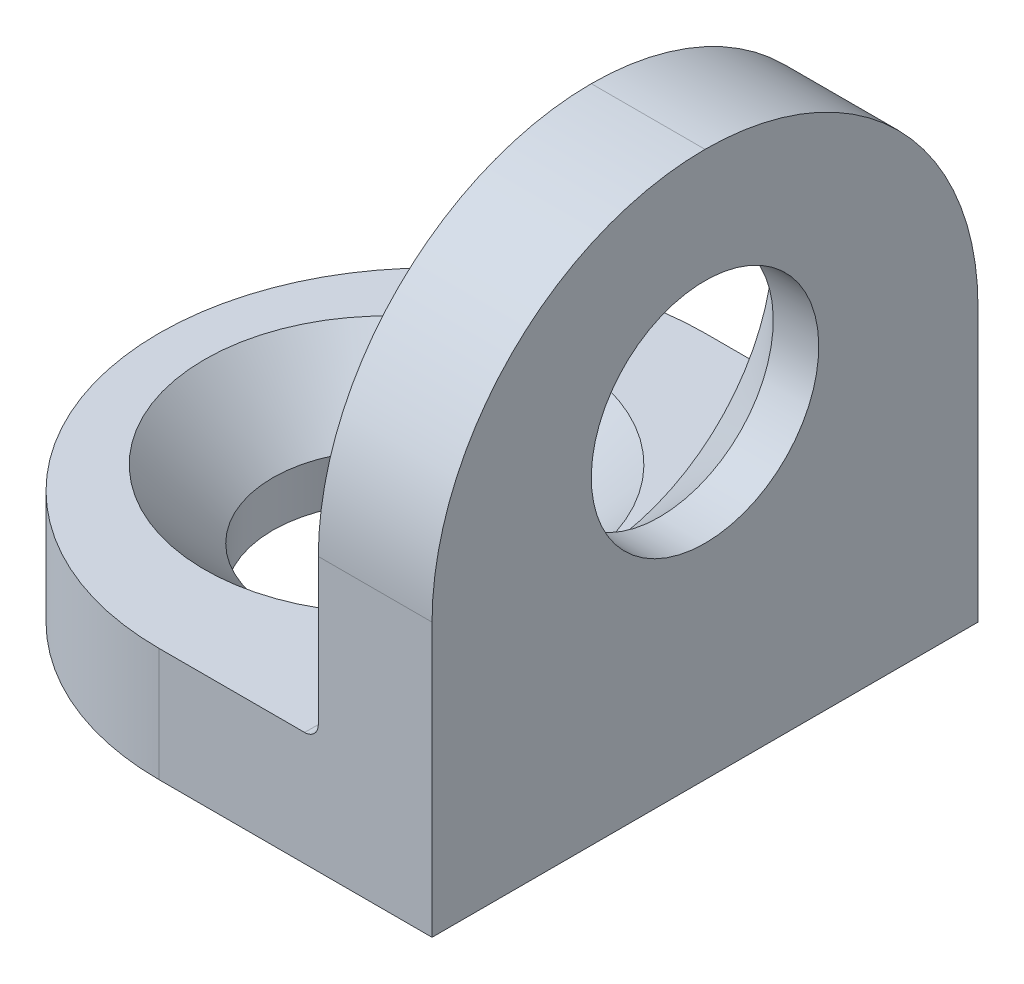
ISO-10303-21;
HEADER;
FILE_DESCRIPTION(('STEP AP214'),'2;1');
FILE_NAME('part.step','',(''),(''),'','','');
FILE_SCHEMA(('AUTOMOTIVE_DESIGN { 1 0 10303 214 1 1 1 1 }'));
ENDSEC;
DATA;
#1=APPLICATION_CONTEXT('core data for automotive mechanical design processes');
#2=APPLICATION_PROTOCOL_DEFINITION('international standard','automotive_design',2000,#1);
#3=PRODUCT_CONTEXT('',#1,'mechanical');
#4=PRODUCT('Part','Part','',(#3));
#5=PRODUCT_RELATED_PRODUCT_CATEGORY('part','',(#4));
#6=PRODUCT_DEFINITION_FORMATION('','',#4);
#7=PRODUCT_DEFINITION_CONTEXT('part definition',#1,'design');
#8=PRODUCT_DEFINITION('design','',#6,#7);
#9=PRODUCT_DEFINITION_SHAPE('','',#8);
#10=(LENGTH_UNIT() NAMED_UNIT(*) SI_UNIT(.MILLI.,.METRE.));
#11=(NAMED_UNIT(*) PLANE_ANGLE_UNIT() SI_UNIT($,.RADIAN.));
#12=(NAMED_UNIT(*) SI_UNIT($,.STERADIAN.) SOLID_ANGLE_UNIT());
#13=UNCERTAINTY_MEASURE_WITH_UNIT(LENGTH_MEASURE(1.E-05),#10,'distance_accuracy_value','');
#14=(GEOMETRIC_REPRESENTATION_CONTEXT(3) GLOBAL_UNCERTAINTY_ASSIGNED_CONTEXT((#13)) GLOBAL_UNIT_ASSIGNED_CONTEXT((#10,
#11,#12)) REPRESENTATION_CONTEXT('',''));
#15=CARTESIAN_POINT('',(0.,0.,0.));
#16=DIRECTION('',(0.,0.,1.));
#17=DIRECTION('',(1.,0.,0.));
#18=AXIS2_PLACEMENT_3D('',#15,#16,#17);
#19=CARTESIAN_POINT('',(9.5,0.,-12.));
#20=DIRECTION('',(0.,1.,0.));
#21=DIRECTION('',(-1.,0.,0.));
#22=AXIS2_PLACEMENT_3D('',#19,#20,#21);
#23=PLANE('',#22);
#24=CARTESIAN_POINT('',(5.,0.,-6.));
#25=DIRECTION('',(0.,1.,0.));
#26=DIRECTION('',(-1.,0.,0.));
#27=AXIS2_PLACEMENT_3D('',#24,#25,#26);
#28=CIRCLE('',#27,4.);
#29=CARTESIAN_POINT('',(0.999999999999999,0.,-6.));
#30=VERTEX_POINT('',#29);
#31=EDGE_CURVE('E11',#30,#30,#28,.F.);
#32=ORIENTED_EDGE('',*,*,#31,.T.);
#33=EDGE_LOOP('',(#32));
#34=FACE_BOUND('',#33,.T.);
#35=DIRECTION('',(-1.,0.,0.));
#36=VECTOR('',#35,1.);
#37=CARTESIAN_POINT('',(9.5,0.,0.));
#38=LINE('',#37,#36);
#39=CARTESIAN_POINT('',(9.2,0.,0.));
#40=VERTEX_POINT('',#39);
#41=CARTESIAN_POINT('',(6.,0.,0.));
#42=VERTEX_POINT('',#41);
#43=EDGE_CURVE('E143',#40,#42,#38,.T.);
#44=ORIENTED_EDGE('',*,*,#43,.F.);
#45=DIRECTION('',(0.,0.,1.));
#46=VECTOR('',#45,1.);
#47=CARTESIAN_POINT('',(9.2,0.,-12.));
#48=LINE('',#47,#46);
#49=CARTESIAN_POINT('',(9.2,0.,-12.));
#50=VERTEX_POINT('',#49);
#51=EDGE_CURVE('E54',#40,#50,#48,.F.);
#52=ORIENTED_EDGE('',*,*,#51,.T.);
#53=DIRECTION('',(-1.,0.,0.));
#54=VECTOR('',#53,1.);
#55=CARTESIAN_POINT('',(9.5,0.,-12.));
#56=LINE('',#55,#54);
#57=CARTESIAN_POINT('',(6.,0.,-12.));
#58=VERTEX_POINT('',#57);
#59=EDGE_CURVE('E123',#50,#58,#56,.T.);
#60=ORIENTED_EDGE('',*,*,#59,.T.);
#61=CARTESIAN_POINT('',(6.,0.,-6.));
#62=DIRECTION('',(0.,1.,0.));
#63=DIRECTION('',(-1.,0.,0.));
#64=AXIS2_PLACEMENT_3D('',#61,#62,#63);
#65=CIRCLE('',#64,6.);
#66=CARTESIAN_POINT('',(0.,0.,-6.));
#67=VERTEX_POINT('',#66);
#68=EDGE_CURVE('E171',#58,#67,#65,.T.);
#69=ORIENTED_EDGE('',*,*,#68,.T.);
#70=CARTESIAN_POINT('',(6.,0.,-6.));
#71=DIRECTION('',(0.,1.,0.));
#72=DIRECTION('',(-1.,0.,0.));
#73=AXIS2_PLACEMENT_3D('',#70,#71,#72);
#74=CIRCLE('',#73,6.);
#75=EDGE_CURVE('E173',#67,#42,#74,.T.);
#76=ORIENTED_EDGE('',*,*,#75,.T.);
#77=EDGE_LOOP('',(#44,#52,#60,#69,#76));
#78=FACE_BOUND('',#77,.T.);
#79=ADVANCED_FACE('F38',(#34,#78),#23,.T.);
#80=CARTESIAN_POINT('',(9.5,9.5,-12.));
#81=DIRECTION('',(-1.,0.,0.));
#82=DIRECTION('',(0.,-1.,0.));
#83=AXIS2_PLACEMENT_3D('',#80,#81,#82);
#84=PLANE('',#83);
#85=CARTESIAN_POINT('',(9.5,4.5,-6.));
#86=DIRECTION('',(-1.,0.,0.));
#87=DIRECTION('',(0.,-1.,0.));
#88=AXIS2_PLACEMENT_3D('',#85,#86,#87);
#89=CIRCLE('',#88,4.00000000000001);
#90=CARTESIAN_POINT('',(9.5,0.499999999999993,-6.));
#91=VERTEX_POINT('',#90);
#92=EDGE_CURVE('E191',#91,#91,#89,.F.);
#93=ORIENTED_EDGE('',*,*,#92,.T.);
#94=EDGE_LOOP('',(#93));
#95=FACE_BOUND('',#94,.T.);
#96=DIRECTION('',(0.,-1.,0.));
#97=VECTOR('',#96,1.);
#98=CARTESIAN_POINT('',(9.5,9.5,-12.));
#99=LINE('',#98,#97);
#100=CARTESIAN_POINT('',(9.5,3.5,-12.));
#101=VERTEX_POINT('',#100);
#102=CARTESIAN_POINT('',(9.5,0.3,-12.));
#103=VERTEX_POINT('',#102);
#104=EDGE_CURVE('E132',#101,#103,#99,.T.);
#105=ORIENTED_EDGE('',*,*,#104,.T.);
#106=DIRECTION('',(0.,0.,1.));
#107=VECTOR('',#106,1.);
#108=CARTESIAN_POINT('',(9.5,0.3,0.));
#109=LINE('',#108,#107);
#110=CARTESIAN_POINT('',(9.5,0.3,0.));
#111=VERTEX_POINT('',#110);
#112=EDGE_CURVE('E178',#103,#111,#109,.T.);
#113=ORIENTED_EDGE('',*,*,#112,.T.);
#114=DIRECTION('',(0.,-1.,0.));
#115=VECTOR('',#114,1.);
#116=CARTESIAN_POINT('',(9.5,9.5,0.));
#117=LINE('',#116,#115);
#118=CARTESIAN_POINT('',(9.5,3.5,0.));
#119=VERTEX_POINT('',#118);
#120=EDGE_CURVE('E149',#119,#111,#117,.T.);
#121=ORIENTED_EDGE('',*,*,#120,.F.);
#122=CARTESIAN_POINT('',(9.5,3.5,-6.));
#123=DIRECTION('',(-1.,0.,0.));
#124=DIRECTION('',(0.,-1.,0.));
#125=AXIS2_PLACEMENT_3D('',#122,#123,#124);
#126=CIRCLE('',#125,6.);
#127=CARTESIAN_POINT('',(9.5,9.5,-6.));
#128=VERTEX_POINT('',#127);
#129=EDGE_CURVE('E155',#119,#128,#126,.T.);
#130=ORIENTED_EDGE('',*,*,#129,.T.);
#131=CARTESIAN_POINT('',(9.5,3.5,-6.));
#132=DIRECTION('',(-1.,0.,0.));
#133=DIRECTION('',(0.,-1.,0.));
#134=AXIS2_PLACEMENT_3D('',#131,#132,#133);
#135=CIRCLE('',#134,6.);
#136=EDGE_CURVE('E153',#128,#101,#135,.T.);
#137=ORIENTED_EDGE('',*,*,#136,.T.);
#138=EDGE_LOOP('',(#105,#113,#121,#130,#137));
#139=FACE_BOUND('',#138,.T.);
#140=ADVANCED_FACE('F209',(#95,#139),#84,.T.);
#141=CARTESIAN_POINT('',(12.,-2.5,-12.));
#142=DIRECTION('',(1.,0.,0.));
#143=DIRECTION('',(0.,0.,-1.));
#144=AXIS2_PLACEMENT_3D('',#141,#142,#143);
#145=PLANE('',#144);
#146=CARTESIAN_POINT('',(12.,4.5,-6.));
#147=DIRECTION('',(-1.,0.,0.));
#148=DIRECTION('',(0.,-1.,0.));
#149=AXIS2_PLACEMENT_3D('',#146,#147,#148);
#150=CIRCLE('',#149,2.5);
#151=CARTESIAN_POINT('',(12.,2.,-6.));
#152=VERTEX_POINT('',#151);
#153=EDGE_CURVE('E267',#152,#152,#150,.T.);
#154=ORIENTED_EDGE('',*,*,#153,.T.);
#155=EDGE_LOOP('',(#154));
#156=FACE_BOUND('',#155,.T.);
#157=CARTESIAN_POINT('',(12.,3.5,-6.));
#158=DIRECTION('',(1.,0.,0.));
#159=DIRECTION('',(0.,0.,-1.));
#160=AXIS2_PLACEMENT_3D('',#157,#158,#159);
#161=CIRCLE('',#160,6.);
#162=CARTESIAN_POINT('',(12.,3.5,-12.));
#163=VERTEX_POINT('',#162);
#164=CARTESIAN_POINT('',(12.,9.5,-6.));
#165=VERTEX_POINT('',#164);
#166=EDGE_CURVE('E157',#163,#165,#161,.T.);
#167=ORIENTED_EDGE('',*,*,#166,.T.);
#168=CARTESIAN_POINT('',(12.,3.5,-6.));
#169=DIRECTION('',(1.,0.,0.));
#170=DIRECTION('',(0.,0.,-1.));
#171=AXIS2_PLACEMENT_3D('',#168,#169,#170);
#172=CIRCLE('',#171,6.);
#173=CARTESIAN_POINT('',(12.,3.5,0.));
#174=VERTEX_POINT('',#173);
#175=EDGE_CURVE('E159',#165,#174,#172,.T.);
#176=ORIENTED_EDGE('',*,*,#175,.T.);
#177=DIRECTION('',(0.,1.,0.));
#178=VECTOR('',#177,1.);
#179=CARTESIAN_POINT('',(12.,-2.5,0.));
#180=LINE('',#179,#178);
#181=CARTESIAN_POINT('',(12.,-2.5,0.));
#182=VERTEX_POINT('',#181);
#183=EDGE_CURVE('E130',#182,#174,#180,.T.);
#184=ORIENTED_EDGE('',*,*,#183,.F.);
#185=DIRECTION('',(0.,0.,1.));
#186=VECTOR('',#185,1.);
#187=CARTESIAN_POINT('',(12.,-2.5,-12.));
#188=LINE('',#187,#186);
#189=CARTESIAN_POINT('',(12.,-2.5,-12.));
#190=VERTEX_POINT('',#189);
#191=EDGE_CURVE('E114',#190,#182,#188,.T.);
#192=ORIENTED_EDGE('',*,*,#191,.F.);
#193=DIRECTION('',(0.,1.,0.));
#194=VECTOR('',#193,1.);
#195=CARTESIAN_POINT('',(12.,-2.5,-12.));
#196=LINE('',#195,#194);
#197=EDGE_CURVE('E122',#190,#163,#196,.T.);
#198=ORIENTED_EDGE('',*,*,#197,.T.);
#199=EDGE_LOOP('',(#167,#176,#184,#192,#198));
#200=FACE_BOUND('',#199,.T.);
#201=ADVANCED_FACE('F127',(#156,#200),#145,.T.);
#202=CARTESIAN_POINT('',(0.,-2.5,-12.));
#203=DIRECTION('',(0.,-1.,0.));
#204=DIRECTION('',(0.,0.,-1.));
#205=AXIS2_PLACEMENT_3D('',#202,#203,#204);
#206=PLANE('',#205);
#207=CARTESIAN_POINT('',(5.,-2.5,-6.));
#208=DIRECTION('',(0.,1.,0.));
#209=DIRECTION('',(-1.,0.,0.));
#210=AXIS2_PLACEMENT_3D('',#207,#208,#209);
#211=CIRCLE('',#210,2.5);
#212=CARTESIAN_POINT('',(2.5,-2.5,-6.));
#213=VERTEX_POINT('',#212);
#214=EDGE_CURVE('E181',#213,#213,#211,.T.);
#215=ORIENTED_EDGE('',*,*,#214,.T.);
#216=EDGE_LOOP('',(#215));
#217=FACE_BOUND('',#216,.T.);
#218=DIRECTION('',(1.,0.,0.));
#219=VECTOR('',#218,1.);
#220=CARTESIAN_POINT('',(0.,-2.5,0.));
#221=LINE('',#220,#219);
#222=CARTESIAN_POINT('',(6.,-2.5,0.));
#223=VERTEX_POINT('',#222);
#224=EDGE_CURVE('E145',#223,#182,#221,.T.);
#225=ORIENTED_EDGE('',*,*,#224,.F.);
#226=CARTESIAN_POINT('',(6.,-2.5,-6.));
#227=DIRECTION('',(0.,-1.,0.));
#228=DIRECTION('',(0.,0.,-1.));
#229=AXIS2_PLACEMENT_3D('',#226,#227,#228);
#230=CIRCLE('',#229,6.);
#231=CARTESIAN_POINT('',(0.,-2.5,-6.));
#232=VERTEX_POINT('',#231);
#233=EDGE_CURVE('E169',#223,#232,#230,.T.);
#234=ORIENTED_EDGE('',*,*,#233,.T.);
#235=CARTESIAN_POINT('',(6.,-2.5,-6.));
#236=DIRECTION('',(0.,-1.,0.));
#237=DIRECTION('',(0.,0.,-1.));
#238=AXIS2_PLACEMENT_3D('',#235,#236,#237);
#239=CIRCLE('',#238,6.);
#240=CARTESIAN_POINT('',(6.,-2.5,-12.));
#241=VERTEX_POINT('',#240);
#242=EDGE_CURVE('E117',#232,#241,#239,.T.);
#243=ORIENTED_EDGE('',*,*,#242,.T.);
#244=DIRECTION('',(1.,0.,0.));
#245=VECTOR('',#244,1.);
#246=CARTESIAN_POINT('',(0.,-2.5,-12.));
#247=LINE('',#246,#245);
#248=EDGE_CURVE('E110',#241,#190,#247,.T.);
#249=ORIENTED_EDGE('',*,*,#248,.T.);
#250=ORIENTED_EDGE('',*,*,#191,.T.);
#251=EDGE_LOOP('',(#225,#234,#243,#249,#250));
#252=FACE_BOUND('',#251,.T.);
#253=ADVANCED_FACE('F113',(#217,#252),#206,.T.);
#254=CARTESIAN_POINT('',(0.,0.,-12.));
#255=DIRECTION('',(0.,0.,1.));
#256=DIRECTION('',(1.,0.,0.));
#257=AXIS2_PLACEMENT_3D('',#254,#255,#256);
#258=PLANE('',#257);
#259=ORIENTED_EDGE('',*,*,#248,.F.);
#260=DIRECTION('',(0.,-1.,0.));
#261=VECTOR('',#260,1.);
#262=CARTESIAN_POINT('',(6.,0.,-12.));
#263=LINE('',#262,#261);
#264=EDGE_CURVE('E176',#241,#58,#263,.F.);
#265=ORIENTED_EDGE('',*,*,#264,.T.);
#266=ORIENTED_EDGE('',*,*,#59,.F.);
#267=CARTESIAN_POINT('',(9.2,0.3,-12.));
#268=DIRECTION('',(0.,0.,1.));
#269=DIRECTION('',(1.,0.,0.));
#270=AXIS2_PLACEMENT_3D('',#267,#268,#269);
#271=CIRCLE('',#270,0.3);
#272=EDGE_CURVE('E186',#50,#103,#271,.T.);
#273=ORIENTED_EDGE('',*,*,#272,.T.);
#274=ORIENTED_EDGE('',*,*,#104,.F.);
#275=DIRECTION('',(-1.,0.,0.));
#276=VECTOR('',#275,1.);
#277=CARTESIAN_POINT('',(12.,3.5,-12.));
#278=LINE('',#277,#276);
#279=EDGE_CURVE('E137',#101,#163,#278,.F.);
#280=ORIENTED_EDGE('',*,*,#279,.T.);
#281=ORIENTED_EDGE('',*,*,#197,.F.);
#282=EDGE_LOOP('',(#259,#265,#266,#273,#274,#280,#281));
#283=FACE_BOUND('',#282,.T.);
#284=ADVANCED_FACE('F134',(#283),#258,.F.);
#285=CARTESIAN_POINT('',(0.,0.,0.));
#286=DIRECTION('',(0.,0.,1.));
#287=DIRECTION('',(1.,0.,0.));
#288=AXIS2_PLACEMENT_3D('',#285,#286,#287);
#289=PLANE('',#288);
#290=ORIENTED_EDGE('',*,*,#120,.T.);
#291=CARTESIAN_POINT('',(9.2,0.3,0.));
#292=DIRECTION('',(0.,0.,1.));
#293=DIRECTION('',(1.,0.,0.));
#294=AXIS2_PLACEMENT_3D('',#291,#292,#293);
#295=CIRCLE('',#294,0.3);
#296=EDGE_CURVE('E62',#111,#40,#295,.F.);
#297=ORIENTED_EDGE('',*,*,#296,.T.);
#298=ORIENTED_EDGE('',*,*,#43,.T.);
#299=DIRECTION('',(0.,-1.,0.));
#300=VECTOR('',#299,1.);
#301=CARTESIAN_POINT('',(6.,0.,0.));
#302=LINE('',#301,#300);
#303=EDGE_CURVE('E162',#42,#223,#302,.T.);
#304=ORIENTED_EDGE('',*,*,#303,.T.);
#305=ORIENTED_EDGE('',*,*,#224,.T.);
#306=ORIENTED_EDGE('',*,*,#183,.T.);
#307=DIRECTION('',(-1.,0.,0.));
#308=VECTOR('',#307,1.);
#309=CARTESIAN_POINT('',(0.,3.5,0.));
#310=LINE('',#309,#308);
#311=EDGE_CURVE('E131',#174,#119,#310,.T.);
#312=ORIENTED_EDGE('',*,*,#311,.T.);
#313=EDGE_LOOP('',(#290,#297,#298,#304,#305,#306,#312));
#314=FACE_BOUND('',#313,.T.);
#315=ADVANCED_FACE('F228',(#314),#289,.T.);
#316=CARTESIAN_POINT('',(12.,3.5,-6.));
#317=DIRECTION('',(1.,0.,0.));
#318=DIRECTION('',(0.,0.,-1.));
#319=AXIS2_PLACEMENT_3D('',#316,#317,#318);
#320=CYLINDRICAL_SURFACE('',#319,6.);
#321=DIRECTION('',(-1.,0.,0.));
#322=VECTOR('',#321,1.);
#323=CARTESIAN_POINT('',(9.5,9.5,-6.));
#324=LINE('',#323,#322);
#325=EDGE_CURVE('E146',#165,#128,#324,.T.);
#326=ORIENTED_EDGE('',*,*,#325,.F.);
#327=ORIENTED_EDGE('',*,*,#166,.F.);
#328=ORIENTED_EDGE('',*,*,#279,.F.);
#329=ORIENTED_EDGE('',*,*,#136,.F.);
#330=EDGE_LOOP('',(#326,#327,#328,#329));
#331=FACE_BOUND('',#330,.T.);
#332=ADVANCED_FACE('F224',(#331),#320,.T.);
#333=CARTESIAN_POINT('',(0.,3.5,-6.));
#334=DIRECTION('',(-1.,0.,0.));
#335=DIRECTION('',(0.,0.,1.));
#336=AXIS2_PLACEMENT_3D('',#333,#334,#335);
#337=CYLINDRICAL_SURFACE('',#336,6.);
#338=ORIENTED_EDGE('',*,*,#175,.F.);
#339=ORIENTED_EDGE('',*,*,#325,.T.);
#340=ORIENTED_EDGE('',*,*,#129,.F.);
#341=ORIENTED_EDGE('',*,*,#311,.F.);
#342=EDGE_LOOP('',(#338,#339,#340,#341));
#343=FACE_BOUND('',#342,.T.);
#344=ADVANCED_FACE('F220',(#343),#337,.T.);
#345=CARTESIAN_POINT('',(6.,0.,-6.));
#346=DIRECTION('',(0.,1.,0.));
#347=DIRECTION('',(-1.,0.,0.));
#348=AXIS2_PLACEMENT_3D('',#345,#346,#347);
#349=CYLINDRICAL_SURFACE('',#348,6.);
#350=DIRECTION('',(0.,-1.,0.));
#351=VECTOR('',#350,1.);
#352=CARTESIAN_POINT('',(0.,-2.5,-6.));
#353=LINE('',#352,#351);
#354=EDGE_CURVE('E165',#67,#232,#353,.T.);
#355=ORIENTED_EDGE('',*,*,#354,.F.);
#356=ORIENTED_EDGE('',*,*,#68,.F.);
#357=ORIENTED_EDGE('',*,*,#264,.F.);
#358=ORIENTED_EDGE('',*,*,#242,.F.);
#359=EDGE_LOOP('',(#355,#356,#357,#358));
#360=FACE_BOUND('',#359,.T.);
#361=ADVANCED_FACE('F223',(#360),#349,.T.);
#362=CARTESIAN_POINT('',(6.,0.,-6.));
#363=DIRECTION('',(0.,-1.,0.));
#364=DIRECTION('',(1.,0.,0.));
#365=AXIS2_PLACEMENT_3D('',#362,#363,#364);
#366=CYLINDRICAL_SURFACE('',#365,6.);
#367=ORIENTED_EDGE('',*,*,#75,.F.);
#368=ORIENTED_EDGE('',*,*,#354,.T.);
#369=ORIENTED_EDGE('',*,*,#233,.F.);
#370=ORIENTED_EDGE('',*,*,#303,.F.);
#371=EDGE_LOOP('',(#367,#368,#369,#370));
#372=FACE_BOUND('',#371,.T.);
#373=ADVANCED_FACE('F230',(#372),#366,.T.);
#374=CARTESIAN_POINT('',(5.,-2.5,-6.));
#375=DIRECTION('',(0.,1.,0.));
#376=DIRECTION('',(-1.,0.,0.));
#377=AXIS2_PLACEMENT_3D('',#374,#375,#376);
#378=CYLINDRICAL_SURFACE('',#377,2.5);
#379=CARTESIAN_POINT('',(5.,-1.5,-6.));
#380=DIRECTION('',(0.,1.,0.));
#381=DIRECTION('',(0.,0.,1.));
#382=AXIS2_PLACEMENT_3D('',#379,#380,#381);
#383=CIRCLE('',#382,2.5);
#384=CARTESIAN_POINT('',(5.,-1.5,-3.5));
#385=VERTEX_POINT('',#384);
#386=EDGE_CURVE('E47',#385,#385,#383,.T.);
#387=ORIENTED_EDGE('',*,*,#386,.T.);
#388=EDGE_LOOP('',(#387));
#389=FACE_BOUND('',#388,.T.);
#390=ORIENTED_EDGE('',*,*,#214,.F.);
#391=EDGE_LOOP('',(#390));
#392=FACE_BOUND('',#391,.T.);
#393=ADVANCED_FACE('F196',(#389,#392),#378,.F.);
#394=CARTESIAN_POINT('',(9.2,0.3,-12.));
#395=DIRECTION('',(0.,0.,-1.));
#396=DIRECTION('',(-1.,0.,0.));
#397=AXIS2_PLACEMENT_3D('',#394,#395,#396);
#398=CYLINDRICAL_SURFACE('',#397,0.3);
#399=ORIENTED_EDGE('',*,*,#272,.F.);
#400=ORIENTED_EDGE('',*,*,#51,.F.);
#401=ORIENTED_EDGE('',*,*,#296,.F.);
#402=ORIENTED_EDGE('',*,*,#112,.F.);
#403=EDGE_LOOP('',(#399,#400,#401,#402));
#404=FACE_BOUND('',#403,.T.);
#405=ADVANCED_FACE('F237',(#404),#398,.F.);
#406=CARTESIAN_POINT('',(12.,4.5,-6.));
#407=DIRECTION('',(-1.,0.,0.));
#408=DIRECTION('',(0.,-1.,0.));
#409=AXIS2_PLACEMENT_3D('',#406,#407,#408);
#410=CYLINDRICAL_SURFACE('',#409,2.5);
#411=CARTESIAN_POINT('',(11.,4.5,-6.));
#412=DIRECTION('',(-1.,0.,0.));
#413=DIRECTION('',(0.,-1.,0.));
#414=AXIS2_PLACEMENT_3D('',#411,#412,#413);
#415=CIRCLE('',#414,2.5);
#416=CARTESIAN_POINT('',(11.,2.,-6.));
#417=VERTEX_POINT('',#416);
#418=EDGE_CURVE('E188',#417,#417,#415,.T.);
#419=ORIENTED_EDGE('',*,*,#418,.T.);
#420=EDGE_LOOP('',(#419));
#421=FACE_BOUND('',#420,.T.);
#422=ORIENTED_EDGE('',*,*,#153,.F.);
#423=EDGE_LOOP('',(#422));
#424=FACE_BOUND('',#423,.T.);
#425=ADVANCED_FACE('F205',(#421,#424),#410,.F.);
#426=CARTESIAN_POINT('',(11.,4.5,-6.));
#427=DIRECTION('',(-1.,0.,0.));
#428=DIRECTION('',(0.,-1.,0.));
#429=AXIS2_PLACEMENT_3D('',#426,#427,#428);
#430=CONICAL_SURFACE('',#429,2.5,0.785398163397451);
#431=ORIENTED_EDGE('',*,*,#92,.F.);
#432=EDGE_LOOP('',(#431));
#433=FACE_BOUND('',#432,.T.);
#434=ORIENTED_EDGE('',*,*,#418,.F.);
#435=EDGE_LOOP('',(#434));
#436=FACE_BOUND('',#435,.T.);
#437=ADVANCED_FACE('F200',(#433,#436),#430,.F.);
#438=CARTESIAN_POINT('',(5.,-1.5,-6.));
#439=DIRECTION('',(0.,1.,0.));
#440=DIRECTION('',(0.,0.,1.));
#441=AXIS2_PLACEMENT_3D('',#438,#439,#440);
#442=CONICAL_SURFACE('',#441,2.5,0.78539816339745);
#443=ORIENTED_EDGE('',*,*,#31,.F.);
#444=EDGE_LOOP('',(#443));
#445=FACE_BOUND('',#444,.T.);
#446=ORIENTED_EDGE('',*,*,#386,.F.);
#447=EDGE_LOOP('',(#446));
#448=FACE_BOUND('',#447,.T.);
#449=ADVANCED_FACE('F41',(#445,#448),#442,.F.);
#450=CLOSED_SHELL('',(#79,#140,#201,#253,#284,#315,#332,#344,#361,#373,#393,#405,#425,#437,#449));
#451=MANIFOLD_SOLID_BREP('B2',#450);
#452=ADVANCED_BREP_SHAPE_REPRESENTATION('',(#18,#451),#14);
#453=SHAPE_DEFINITION_REPRESENTATION(#9,#452);
ENDSEC;
END-ISO-10303-21;
